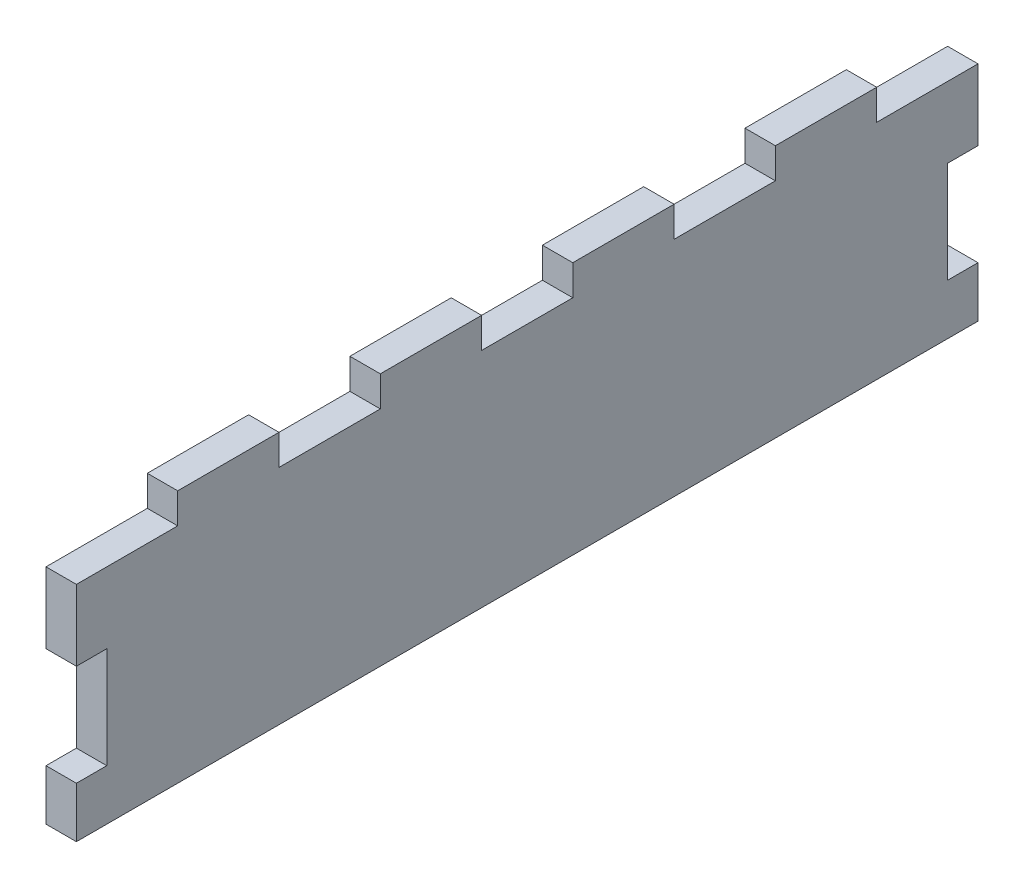
ISO-10303-21;
HEADER;
FILE_DESCRIPTION(('STEP AP214'),'2;1');
FILE_NAME('part.step','',(''),(''),'','','');
FILE_SCHEMA(('AUTOMOTIVE_DESIGN { 1 0 10303 214 1 1 1 1 }'));
ENDSEC;
DATA;
#1=APPLICATION_CONTEXT('core data for automotive mechanical design processes');
#2=APPLICATION_PROTOCOL_DEFINITION('international standard','automotive_design',2000,#1);
#3=PRODUCT_CONTEXT('',#1,'mechanical');
#4=PRODUCT('Part','Part','',(#3));
#5=PRODUCT_RELATED_PRODUCT_CATEGORY('part','',(#4));
#6=PRODUCT_DEFINITION_FORMATION('','',#4);
#7=PRODUCT_DEFINITION_CONTEXT('part definition',#1,'design');
#8=PRODUCT_DEFINITION('design','',#6,#7);
#9=PRODUCT_DEFINITION_SHAPE('','',#8);
#10=(LENGTH_UNIT() NAMED_UNIT(*) SI_UNIT(.MILLI.,.METRE.));
#11=(NAMED_UNIT(*) PLANE_ANGLE_UNIT() SI_UNIT($,.RADIAN.));
#12=(NAMED_UNIT(*) SI_UNIT($,.STERADIAN.) SOLID_ANGLE_UNIT());
#13=UNCERTAINTY_MEASURE_WITH_UNIT(LENGTH_MEASURE(1.E-05),#10,'distance_accuracy_value','');
#14=(GEOMETRIC_REPRESENTATION_CONTEXT(3) GLOBAL_UNCERTAINTY_ASSIGNED_CONTEXT((#13)) GLOBAL_UNIT_ASSIGNED_CONTEXT((#10,
#11,#12)) REPRESENTATION_CONTEXT('',''));
#15=CARTESIAN_POINT('',(0.,0.,0.));
#16=DIRECTION('',(0.,0.,1.));
#17=DIRECTION('',(1.,0.,0.));
#18=AXIS2_PLACEMENT_3D('',#15,#16,#17);
#19=CARTESIAN_POINT('',(3.,0.,0.));
#20=DIRECTION('',(0.,0.,-1.));
#21=DIRECTION('',(-1.,0.,0.));
#22=AXIS2_PLACEMENT_3D('',#19,#20,#21);
#23=PLANE('',#22);
#24=DIRECTION('',(0.,-1.,0.));
#25=VECTOR('',#24,1.);
#26=CARTESIAN_POINT('',(0.,0.,0.));
#27=LINE('',#26,#25);
#28=CARTESIAN_POINT('',(0.,5.,0.));
#29=VERTEX_POINT('',#28);
#30=CARTESIAN_POINT('',(0.,0.,0.));
#31=VERTEX_POINT('',#30);
#32=EDGE_CURVE('E248',#29,#31,#27,.T.);
#33=ORIENTED_EDGE('',*,*,#32,.T.);
#34=DIRECTION('',(-1.,0.,0.));
#35=VECTOR('',#34,1.);
#36=CARTESIAN_POINT('',(3.,0.,0.));
#37=LINE('',#36,#35);
#38=CARTESIAN_POINT('',(3.,0.,0.));
#39=VERTEX_POINT('',#38);
#40=EDGE_CURVE('E11',#39,#31,#37,.T.);
#41=ORIENTED_EDGE('',*,*,#40,.F.);
#42=DIRECTION('',(0.,-1.,0.));
#43=VECTOR('',#42,1.);
#44=CARTESIAN_POINT('',(3.,0.,0.));
#45=LINE('',#44,#43);
#46=CARTESIAN_POINT('',(3.,5.,0.));
#47=VERTEX_POINT('',#46);
#48=EDGE_CURVE('E302',#47,#39,#45,.T.);
#49=ORIENTED_EDGE('',*,*,#48,.F.);
#50=DIRECTION('',(-1.,0.,0.));
#51=VECTOR('',#50,1.);
#52=CARTESIAN_POINT('',(3.,5.,0.));
#53=LINE('',#52,#51);
#54=EDGE_CURVE('E244',#47,#29,#53,.T.);
#55=ORIENTED_EDGE('',*,*,#54,.T.);
#56=EDGE_LOOP('',(#33,#41,#49,#55));
#57=FACE_BOUND('',#56,.T.);
#58=ADVANCED_FACE('F32',(#57),#23,.F.);
#59=CARTESIAN_POINT('',(3.,0.,0.));
#60=DIRECTION('',(0.,1.,0.));
#61=DIRECTION('',(0.,0.,1.));
#62=AXIS2_PLACEMENT_3D('',#59,#60,#61);
#63=PLANE('',#62);
#64=DIRECTION('',(0.,0.,-1.));
#65=VECTOR('',#64,1.);
#66=CARTESIAN_POINT('',(0.,0.,0.));
#67=LINE('',#66,#65);
#68=CARTESIAN_POINT('',(0.,0.,-89.));
#69=VERTEX_POINT('',#68);
#70=EDGE_CURVE('E251',#31,#69,#67,.T.);
#71=ORIENTED_EDGE('',*,*,#70,.T.);
#72=DIRECTION('',(-1.,0.,0.));
#73=VECTOR('',#72,1.);
#74=CARTESIAN_POINT('',(3.,0.,-89.));
#75=LINE('',#74,#73);
#76=CARTESIAN_POINT('',(3.,0.,-89.));
#77=VERTEX_POINT('',#76);
#78=EDGE_CURVE('E40',#77,#69,#75,.T.);
#79=ORIENTED_EDGE('',*,*,#78,.F.);
#80=DIRECTION('',(0.,0.,-1.));
#81=VECTOR('',#80,1.);
#82=CARTESIAN_POINT('',(3.,0.,0.));
#83=LINE('',#82,#81);
#84=EDGE_CURVE('E151',#39,#77,#83,.T.);
#85=ORIENTED_EDGE('',*,*,#84,.F.);
#86=ORIENTED_EDGE('',*,*,#40,.T.);
#87=EDGE_LOOP('',(#71,#79,#85,#86));
#88=FACE_BOUND('',#87,.T.);
#89=ADVANCED_FACE('F460',(#88),#63,.F.);
#90=CARTESIAN_POINT('',(3.,0.,-89.));
#91=DIRECTION('',(0.,0.,1.));
#92=DIRECTION('',(1.,0.,0.));
#93=AXIS2_PLACEMENT_3D('',#90,#91,#92);
#94=PLANE('',#93);
#95=DIRECTION('',(0.,1.,0.));
#96=VECTOR('',#95,1.);
#97=CARTESIAN_POINT('',(0.,0.,-89.));
#98=LINE('',#97,#96);
#99=CARTESIAN_POINT('',(0.,5.,-89.));
#100=VERTEX_POINT('',#99);
#101=EDGE_CURVE('E253',#69,#100,#98,.T.);
#102=ORIENTED_EDGE('',*,*,#101,.T.);
#103=DIRECTION('',(-1.,0.,0.));
#104=VECTOR('',#103,1.);
#105=CARTESIAN_POINT('',(3.,5.,-89.));
#106=LINE('',#105,#104);
#107=CARTESIAN_POINT('',(3.,5.,-89.));
#108=VERTEX_POINT('',#107);
#109=EDGE_CURVE('E369',#108,#100,#106,.T.);
#110=ORIENTED_EDGE('',*,*,#109,.F.);
#111=DIRECTION('',(0.,1.,0.));
#112=VECTOR('',#111,1.);
#113=CARTESIAN_POINT('',(3.,0.,-89.));
#114=LINE('',#113,#112);
#115=EDGE_CURVE('E377',#77,#108,#114,.T.);
#116=ORIENTED_EDGE('',*,*,#115,.F.);
#117=ORIENTED_EDGE('',*,*,#78,.T.);
#118=EDGE_LOOP('',(#102,#110,#116,#117));
#119=FACE_BOUND('',#118,.T.);
#120=ADVANCED_FACE('F375',(#119),#94,.F.);
#121=CARTESIAN_POINT('',(3.,5.,-89.));
#122=DIRECTION('',(0.,-1.,0.));
#123=DIRECTION('',(0.,0.,-1.));
#124=AXIS2_PLACEMENT_3D('',#121,#122,#123);
#125=PLANE('',#124);
#126=DIRECTION('',(0.,0.,1.));
#127=VECTOR('',#126,1.);
#128=CARTESIAN_POINT('',(0.,5.,-89.));
#129=LINE('',#128,#127);
#130=CARTESIAN_POINT('',(0.,5.,-86.));
#131=VERTEX_POINT('',#130);
#132=EDGE_CURVE('E255',#100,#131,#129,.T.);
#133=ORIENTED_EDGE('',*,*,#132,.T.);
#134=DIRECTION('',(-1.,0.,0.));
#135=VECTOR('',#134,1.);
#136=CARTESIAN_POINT('',(3.,5.,-86.));
#137=LINE('',#136,#135);
#138=CARTESIAN_POINT('',(3.,5.,-86.));
#139=VERTEX_POINT('',#138);
#140=EDGE_CURVE('E366',#139,#131,#137,.T.);
#141=ORIENTED_EDGE('',*,*,#140,.F.);
#142=DIRECTION('',(0.,0.,1.));
#143=VECTOR('',#142,1.);
#144=CARTESIAN_POINT('',(3.,5.,-89.));
#145=LINE('',#144,#143);
#146=EDGE_CURVE('E395',#108,#139,#145,.T.);
#147=ORIENTED_EDGE('',*,*,#146,.F.);
#148=ORIENTED_EDGE('',*,*,#109,.T.);
#149=EDGE_LOOP('',(#133,#141,#147,#148));
#150=FACE_BOUND('',#149,.T.);
#151=ADVANCED_FACE('F386',(#150),#125,.F.);
#152=CARTESIAN_POINT('',(3.,15.,-86.));
#153=DIRECTION('',(0.,0.,1.));
#154=DIRECTION('',(1.,0.,0.));
#155=AXIS2_PLACEMENT_3D('',#152,#153,#154);
#156=PLANE('',#155);
#157=DIRECTION('',(0.,1.,0.));
#158=VECTOR('',#157,1.);
#159=CARTESIAN_POINT('',(0.,15.,-86.));
#160=LINE('',#159,#158);
#161=CARTESIAN_POINT('',(0.,15.,-86.));
#162=VERTEX_POINT('',#161);
#163=EDGE_CURVE('E257',#131,#162,#160,.T.);
#164=ORIENTED_EDGE('',*,*,#163,.T.);
#165=DIRECTION('',(-1.,0.,0.));
#166=VECTOR('',#165,1.);
#167=CARTESIAN_POINT('',(3.,15.,-86.));
#168=LINE('',#167,#166);
#169=CARTESIAN_POINT('',(3.,15.,-86.));
#170=VERTEX_POINT('',#169);
#171=EDGE_CURVE('E363',#170,#162,#168,.T.);
#172=ORIENTED_EDGE('',*,*,#171,.F.);
#173=DIRECTION('',(0.,1.,0.));
#174=VECTOR('',#173,1.);
#175=CARTESIAN_POINT('',(3.,15.,-86.));
#176=LINE('',#175,#174);
#177=EDGE_CURVE('E392',#139,#170,#176,.T.);
#178=ORIENTED_EDGE('',*,*,#177,.F.);
#179=ORIENTED_EDGE('',*,*,#140,.T.);
#180=EDGE_LOOP('',(#164,#172,#178,#179));
#181=FACE_BOUND('',#180,.T.);
#182=ADVANCED_FACE('F390',(#181),#156,.F.);
#183=CARTESIAN_POINT('',(3.,15.,-89.));
#184=DIRECTION('',(0.,1.,0.));
#185=DIRECTION('',(0.,0.,1.));
#186=AXIS2_PLACEMENT_3D('',#183,#184,#185);
#187=PLANE('',#186);
#188=DIRECTION('',(0.,0.,-1.));
#189=VECTOR('',#188,1.);
#190=CARTESIAN_POINT('',(0.,15.,-89.));
#191=LINE('',#190,#189);
#192=CARTESIAN_POINT('',(0.,15.,-89.));
#193=VERTEX_POINT('',#192);
#194=EDGE_CURVE('E259',#162,#193,#191,.T.);
#195=ORIENTED_EDGE('',*,*,#194,.T.);
#196=DIRECTION('',(-1.,0.,0.));
#197=VECTOR('',#196,1.);
#198=CARTESIAN_POINT('',(3.,15.,-89.));
#199=LINE('',#198,#197);
#200=CARTESIAN_POINT('',(3.,15.,-89.));
#201=VERTEX_POINT('',#200);
#202=EDGE_CURVE('E360',#201,#193,#199,.T.);
#203=ORIENTED_EDGE('',*,*,#202,.F.);
#204=DIRECTION('',(0.,0.,-1.));
#205=VECTOR('',#204,1.);
#206=CARTESIAN_POINT('',(3.,15.,-89.));
#207=LINE('',#206,#205);
#208=EDGE_CURVE('E394',#170,#201,#207,.T.);
#209=ORIENTED_EDGE('',*,*,#208,.F.);
#210=ORIENTED_EDGE('',*,*,#171,.T.);
#211=EDGE_LOOP('',(#195,#203,#209,#210));
#212=FACE_BOUND('',#211,.T.);
#213=ADVANCED_FACE('F473',(#212),#187,.F.);
#214=CARTESIAN_POINT('',(3.,15.,-89.));
#215=DIRECTION('',(0.,0.,1.));
#216=DIRECTION('',(1.,0.,0.));
#217=AXIS2_PLACEMENT_3D('',#214,#215,#216);
#218=PLANE('',#217);
#219=DIRECTION('',(0.,1.,0.));
#220=VECTOR('',#219,1.);
#221=CARTESIAN_POINT('',(0.,15.,-89.));
#222=LINE('',#221,#220);
#223=CARTESIAN_POINT('',(0.,22.,-89.));
#224=VERTEX_POINT('',#223);
#225=EDGE_CURVE('E261',#193,#224,#222,.T.);
#226=ORIENTED_EDGE('',*,*,#225,.T.);
#227=DIRECTION('',(-1.,0.,0.));
#228=VECTOR('',#227,1.);
#229=CARTESIAN_POINT('',(3.,22.,-89.));
#230=LINE('',#229,#228);
#231=CARTESIAN_POINT('',(3.,22.,-89.));
#232=VERTEX_POINT('',#231);
#233=EDGE_CURVE('E357',#232,#224,#230,.T.);
#234=ORIENTED_EDGE('',*,*,#233,.F.);
#235=DIRECTION('',(0.,1.,0.));
#236=VECTOR('',#235,1.);
#237=CARTESIAN_POINT('',(3.,15.,-89.));
#238=LINE('',#237,#236);
#239=EDGE_CURVE('E397',#201,#232,#238,.T.);
#240=ORIENTED_EDGE('',*,*,#239,.F.);
#241=ORIENTED_EDGE('',*,*,#202,.T.);
#242=EDGE_LOOP('',(#226,#234,#240,#241));
#243=FACE_BOUND('',#242,.T.);
#244=ADVANCED_FACE('F476',(#243),#218,.F.);
#245=CARTESIAN_POINT('',(3.,22.,-79.));
#246=DIRECTION('',(0.,-1.,0.));
#247=DIRECTION('',(0.,0.,-1.));
#248=AXIS2_PLACEMENT_3D('',#245,#246,#247);
#249=PLANE('',#248);
#250=DIRECTION('',(0.,0.,1.));
#251=VECTOR('',#250,1.);
#252=CARTESIAN_POINT('',(0.,22.,-79.));
#253=LINE('',#252,#251);
#254=CARTESIAN_POINT('',(0.,22.,-79.));
#255=VERTEX_POINT('',#254);
#256=EDGE_CURVE('E263',#224,#255,#253,.T.);
#257=ORIENTED_EDGE('',*,*,#256,.T.);
#258=DIRECTION('',(-1.,0.,0.));
#259=VECTOR('',#258,1.);
#260=CARTESIAN_POINT('',(3.,22.,-79.));
#261=LINE('',#260,#259);
#262=CARTESIAN_POINT('',(3.,22.,-79.));
#263=VERTEX_POINT('',#262);
#264=EDGE_CURVE('E354',#263,#255,#261,.T.);
#265=ORIENTED_EDGE('',*,*,#264,.F.);
#266=DIRECTION('',(0.,0.,1.));
#267=VECTOR('',#266,1.);
#268=CARTESIAN_POINT('',(3.,22.,-79.));
#269=LINE('',#268,#267);
#270=EDGE_CURVE('E403',#232,#263,#269,.T.);
#271=ORIENTED_EDGE('',*,*,#270,.F.);
#272=ORIENTED_EDGE('',*,*,#233,.T.);
#273=EDGE_LOOP('',(#257,#265,#271,#272));
#274=FACE_BOUND('',#273,.T.);
#275=ADVANCED_FACE('F480',(#274),#249,.F.);
#276=CARTESIAN_POINT('',(3.,22.,-79.));
#277=DIRECTION('',(0.,0.,1.));
#278=DIRECTION('',(1.,0.,0.));
#279=AXIS2_PLACEMENT_3D('',#276,#277,#278);
#280=PLANE('',#279);
#281=DIRECTION('',(0.,1.,0.));
#282=VECTOR('',#281,1.);
#283=CARTESIAN_POINT('',(0.,22.,-79.));
#284=LINE('',#283,#282);
#285=CARTESIAN_POINT('',(0.,25.,-79.));
#286=VERTEX_POINT('',#285);
#287=EDGE_CURVE('E265',#255,#286,#284,.T.);
#288=ORIENTED_EDGE('',*,*,#287,.T.);
#289=DIRECTION('',(-1.,0.,0.));
#290=VECTOR('',#289,1.);
#291=CARTESIAN_POINT('',(3.,25.,-79.));
#292=LINE('',#291,#290);
#293=CARTESIAN_POINT('',(3.,25.,-79.));
#294=VERTEX_POINT('',#293);
#295=EDGE_CURVE('E351',#294,#286,#292,.T.);
#296=ORIENTED_EDGE('',*,*,#295,.F.);
#297=DIRECTION('',(0.,1.,0.));
#298=VECTOR('',#297,1.);
#299=CARTESIAN_POINT('',(3.,22.,-79.));
#300=LINE('',#299,#298);
#301=EDGE_CURVE('E405',#263,#294,#300,.T.);
#302=ORIENTED_EDGE('',*,*,#301,.F.);
#303=ORIENTED_EDGE('',*,*,#264,.T.);
#304=EDGE_LOOP('',(#288,#296,#302,#303));
#305=FACE_BOUND('',#304,.T.);
#306=ADVANCED_FACE('F484',(#305),#280,.F.);
#307=CARTESIAN_POINT('',(3.,25.,-69.));
#308=DIRECTION('',(0.,-1.,0.));
#309=DIRECTION('',(0.,0.,-1.));
#310=AXIS2_PLACEMENT_3D('',#307,#308,#309);
#311=PLANE('',#310);
#312=DIRECTION('',(0.,0.,1.));
#313=VECTOR('',#312,1.);
#314=CARTESIAN_POINT('',(0.,25.,-69.));
#315=LINE('',#314,#313);
#316=CARTESIAN_POINT('',(0.,25.,-69.));
#317=VERTEX_POINT('',#316);
#318=EDGE_CURVE('E267',#286,#317,#315,.T.);
#319=ORIENTED_EDGE('',*,*,#318,.T.);
#320=DIRECTION('',(-1.,0.,0.));
#321=VECTOR('',#320,1.);
#322=CARTESIAN_POINT('',(3.,25.,-69.));
#323=LINE('',#322,#321);
#324=CARTESIAN_POINT('',(3.,25.,-69.));
#325=VERTEX_POINT('',#324);
#326=EDGE_CURVE('E348',#325,#317,#323,.T.);
#327=ORIENTED_EDGE('',*,*,#326,.F.);
#328=DIRECTION('',(0.,0.,1.));
#329=VECTOR('',#328,1.);
#330=CARTESIAN_POINT('',(3.,25.,-69.));
#331=LINE('',#330,#329);
#332=EDGE_CURVE('E407',#294,#325,#331,.T.);
#333=ORIENTED_EDGE('',*,*,#332,.F.);
#334=ORIENTED_EDGE('',*,*,#295,.T.);
#335=EDGE_LOOP('',(#319,#327,#333,#334));
#336=FACE_BOUND('',#335,.T.);
#337=ADVANCED_FACE('F488',(#336),#311,.F.);
#338=CARTESIAN_POINT('',(3.,22.,-69.));
#339=DIRECTION('',(0.,0.,-1.));
#340=DIRECTION('',(-1.,0.,0.));
#341=AXIS2_PLACEMENT_3D('',#338,#339,#340);
#342=PLANE('',#341);
#343=DIRECTION('',(0.,-1.,0.));
#344=VECTOR('',#343,1.);
#345=CARTESIAN_POINT('',(0.,22.,-69.));
#346=LINE('',#345,#344);
#347=CARTESIAN_POINT('',(0.,22.,-69.));
#348=VERTEX_POINT('',#347);
#349=EDGE_CURVE('E269',#317,#348,#346,.T.);
#350=ORIENTED_EDGE('',*,*,#349,.T.);
#351=DIRECTION('',(-1.,0.,0.));
#352=VECTOR('',#351,1.);
#353=CARTESIAN_POINT('',(3.,22.,-69.));
#354=LINE('',#353,#352);
#355=CARTESIAN_POINT('',(3.,22.,-69.));
#356=VERTEX_POINT('',#355);
#357=EDGE_CURVE('E345',#356,#348,#354,.T.);
#358=ORIENTED_EDGE('',*,*,#357,.F.);
#359=DIRECTION('',(0.,-1.,0.));
#360=VECTOR('',#359,1.);
#361=CARTESIAN_POINT('',(3.,22.,-69.));
#362=LINE('',#361,#360);
#363=EDGE_CURVE('E409',#325,#356,#362,.T.);
#364=ORIENTED_EDGE('',*,*,#363,.F.);
#365=ORIENTED_EDGE('',*,*,#326,.T.);
#366=EDGE_LOOP('',(#350,#358,#364,#365));
#367=FACE_BOUND('',#366,.T.);
#368=ADVANCED_FACE('F492',(#367),#342,.F.);
#369=CARTESIAN_POINT('',(3.,22.,-59.));
#370=DIRECTION('',(0.,-1.,0.));
#371=DIRECTION('',(0.,0.,-1.));
#372=AXIS2_PLACEMENT_3D('',#369,#370,#371);
#373=PLANE('',#372);
#374=DIRECTION('',(0.,0.,1.));
#375=VECTOR('',#374,1.);
#376=CARTESIAN_POINT('',(0.,22.,-59.));
#377=LINE('',#376,#375);
#378=CARTESIAN_POINT('',(0.,22.,-59.));
#379=VERTEX_POINT('',#378);
#380=EDGE_CURVE('E271',#348,#379,#377,.T.);
#381=ORIENTED_EDGE('',*,*,#380,.T.);
#382=DIRECTION('',(-1.,0.,0.));
#383=VECTOR('',#382,1.);
#384=CARTESIAN_POINT('',(3.,22.,-59.));
#385=LINE('',#384,#383);
#386=CARTESIAN_POINT('',(3.,22.,-59.));
#387=VERTEX_POINT('',#386);
#388=EDGE_CURVE('E342',#387,#379,#385,.T.);
#389=ORIENTED_EDGE('',*,*,#388,.F.);
#390=DIRECTION('',(0.,0.,1.));
#391=VECTOR('',#390,1.);
#392=CARTESIAN_POINT('',(3.,22.,-59.));
#393=LINE('',#392,#391);
#394=EDGE_CURVE('E411',#356,#387,#393,.T.);
#395=ORIENTED_EDGE('',*,*,#394,.F.);
#396=ORIENTED_EDGE('',*,*,#357,.T.);
#397=EDGE_LOOP('',(#381,#389,#395,#396));
#398=FACE_BOUND('',#397,.T.);
#399=ADVANCED_FACE('F496',(#398),#373,.F.);
#400=CARTESIAN_POINT('',(3.,22.,-59.));
#401=DIRECTION('',(0.,0.,1.));
#402=DIRECTION('',(1.,0.,0.));
#403=AXIS2_PLACEMENT_3D('',#400,#401,#402);
#404=PLANE('',#403);
#405=DIRECTION('',(0.,1.,0.));
#406=VECTOR('',#405,1.);
#407=CARTESIAN_POINT('',(0.,22.,-59.));
#408=LINE('',#407,#406);
#409=CARTESIAN_POINT('',(0.,25.,-59.));
#410=VERTEX_POINT('',#409);
#411=EDGE_CURVE('E273',#379,#410,#408,.T.);
#412=ORIENTED_EDGE('',*,*,#411,.T.);
#413=DIRECTION('',(-1.,0.,0.));
#414=VECTOR('',#413,1.);
#415=CARTESIAN_POINT('',(3.,25.,-59.));
#416=LINE('',#415,#414);
#417=CARTESIAN_POINT('',(3.,25.,-59.));
#418=VERTEX_POINT('',#417);
#419=EDGE_CURVE('E339',#418,#410,#416,.T.);
#420=ORIENTED_EDGE('',*,*,#419,.F.);
#421=DIRECTION('',(0.,1.,0.));
#422=VECTOR('',#421,1.);
#423=CARTESIAN_POINT('',(3.,22.,-59.));
#424=LINE('',#423,#422);
#425=EDGE_CURVE('E413',#387,#418,#424,.T.);
#426=ORIENTED_EDGE('',*,*,#425,.F.);
#427=ORIENTED_EDGE('',*,*,#388,.T.);
#428=EDGE_LOOP('',(#412,#420,#426,#427));
#429=FACE_BOUND('',#428,.T.);
#430=ADVANCED_FACE('F500',(#429),#404,.F.);
#431=CARTESIAN_POINT('',(3.,25.,-49.));
#432=DIRECTION('',(0.,-1.,0.));
#433=DIRECTION('',(0.,0.,-1.));
#434=AXIS2_PLACEMENT_3D('',#431,#432,#433);
#435=PLANE('',#434);
#436=DIRECTION('',(0.,0.,1.));
#437=VECTOR('',#436,1.);
#438=CARTESIAN_POINT('',(0.,25.,-49.));
#439=LINE('',#438,#437);
#440=CARTESIAN_POINT('',(0.,25.,-49.));
#441=VERTEX_POINT('',#440);
#442=EDGE_CURVE('E275',#410,#441,#439,.T.);
#443=ORIENTED_EDGE('',*,*,#442,.T.);
#444=DIRECTION('',(-1.,0.,0.));
#445=VECTOR('',#444,1.);
#446=CARTESIAN_POINT('',(3.,25.,-49.));
#447=LINE('',#446,#445);
#448=CARTESIAN_POINT('',(3.,25.,-49.));
#449=VERTEX_POINT('',#448);
#450=EDGE_CURVE('E336',#449,#441,#447,.T.);
#451=ORIENTED_EDGE('',*,*,#450,.F.);
#452=DIRECTION('',(0.,0.,1.));
#453=VECTOR('',#452,1.);
#454=CARTESIAN_POINT('',(3.,25.,-49.));
#455=LINE('',#454,#453);
#456=EDGE_CURVE('E415',#418,#449,#455,.T.);
#457=ORIENTED_EDGE('',*,*,#456,.F.);
#458=ORIENTED_EDGE('',*,*,#419,.T.);
#459=EDGE_LOOP('',(#443,#451,#457,#458));
#460=FACE_BOUND('',#459,.T.);
#461=ADVANCED_FACE('F504',(#460),#435,.F.);
#462=CARTESIAN_POINT('',(3.,22.,-49.));
#463=DIRECTION('',(0.,0.,-1.));
#464=DIRECTION('',(-1.,0.,0.));
#465=AXIS2_PLACEMENT_3D('',#462,#463,#464);
#466=PLANE('',#465);
#467=DIRECTION('',(0.,-1.,0.));
#468=VECTOR('',#467,1.);
#469=CARTESIAN_POINT('',(0.,22.,-49.));
#470=LINE('',#469,#468);
#471=CARTESIAN_POINT('',(0.,22.,-49.));
#472=VERTEX_POINT('',#471);
#473=EDGE_CURVE('E277',#441,#472,#470,.T.);
#474=ORIENTED_EDGE('',*,*,#473,.T.);
#475=DIRECTION('',(-1.,0.,0.));
#476=VECTOR('',#475,1.);
#477=CARTESIAN_POINT('',(3.,22.,-49.));
#478=LINE('',#477,#476);
#479=CARTESIAN_POINT('',(3.,22.,-49.));
#480=VERTEX_POINT('',#479);
#481=EDGE_CURVE('E333',#480,#472,#478,.T.);
#482=ORIENTED_EDGE('',*,*,#481,.F.);
#483=DIRECTION('',(0.,-1.,0.));
#484=VECTOR('',#483,1.);
#485=CARTESIAN_POINT('',(3.,22.,-49.));
#486=LINE('',#485,#484);
#487=EDGE_CURVE('E417',#449,#480,#486,.T.);
#488=ORIENTED_EDGE('',*,*,#487,.F.);
#489=ORIENTED_EDGE('',*,*,#450,.T.);
#490=EDGE_LOOP('',(#474,#482,#488,#489));
#491=FACE_BOUND('',#490,.T.);
#492=ADVANCED_FACE('F508',(#491),#466,.F.);
#493=CARTESIAN_POINT('',(3.,22.,-40.));
#494=DIRECTION('',(0.,-1.,0.));
#495=DIRECTION('',(0.,0.,-1.));
#496=AXIS2_PLACEMENT_3D('',#493,#494,#495);
#497=PLANE('',#496);
#498=DIRECTION('',(0.,0.,1.));
#499=VECTOR('',#498,1.);
#500=CARTESIAN_POINT('',(0.,22.,-40.));
#501=LINE('',#500,#499);
#502=CARTESIAN_POINT('',(0.,22.,-40.));
#503=VERTEX_POINT('',#502);
#504=EDGE_CURVE('E279',#472,#503,#501,.T.);
#505=ORIENTED_EDGE('',*,*,#504,.T.);
#506=DIRECTION('',(-1.,0.,0.));
#507=VECTOR('',#506,1.);
#508=CARTESIAN_POINT('',(3.,22.,-40.));
#509=LINE('',#508,#507);
#510=CARTESIAN_POINT('',(3.,22.,-40.));
#511=VERTEX_POINT('',#510);
#512=EDGE_CURVE('E330',#511,#503,#509,.T.);
#513=ORIENTED_EDGE('',*,*,#512,.F.);
#514=DIRECTION('',(0.,0.,1.));
#515=VECTOR('',#514,1.);
#516=CARTESIAN_POINT('',(3.,22.,-40.));
#517=LINE('',#516,#515);
#518=EDGE_CURVE('E419',#480,#511,#517,.T.);
#519=ORIENTED_EDGE('',*,*,#518,.F.);
#520=ORIENTED_EDGE('',*,*,#481,.T.);
#521=EDGE_LOOP('',(#505,#513,#519,#520));
#522=FACE_BOUND('',#521,.T.);
#523=ADVANCED_FACE('F512',(#522),#497,.F.);
#524=CARTESIAN_POINT('',(3.,22.,-40.));
#525=DIRECTION('',(0.,0.,1.));
#526=DIRECTION('',(1.,0.,0.));
#527=AXIS2_PLACEMENT_3D('',#524,#525,#526);
#528=PLANE('',#527);
#529=DIRECTION('',(0.,1.,0.));
#530=VECTOR('',#529,1.);
#531=CARTESIAN_POINT('',(0.,22.,-40.));
#532=LINE('',#531,#530);
#533=CARTESIAN_POINT('',(0.,25.,-40.));
#534=VERTEX_POINT('',#533);
#535=EDGE_CURVE('E281',#503,#534,#532,.T.);
#536=ORIENTED_EDGE('',*,*,#535,.T.);
#537=DIRECTION('',(-1.,0.,0.));
#538=VECTOR('',#537,1.);
#539=CARTESIAN_POINT('',(3.,25.,-40.));
#540=LINE('',#539,#538);
#541=CARTESIAN_POINT('',(3.,25.,-40.));
#542=VERTEX_POINT('',#541);
#543=EDGE_CURVE('E327',#542,#534,#540,.T.);
#544=ORIENTED_EDGE('',*,*,#543,.F.);
#545=DIRECTION('',(0.,1.,0.));
#546=VECTOR('',#545,1.);
#547=CARTESIAN_POINT('',(3.,22.,-40.));
#548=LINE('',#547,#546);
#549=EDGE_CURVE('E421',#511,#542,#548,.T.);
#550=ORIENTED_EDGE('',*,*,#549,.F.);
#551=ORIENTED_EDGE('',*,*,#512,.T.);
#552=EDGE_LOOP('',(#536,#544,#550,#551));
#553=FACE_BOUND('',#552,.T.);
#554=ADVANCED_FACE('F516',(#553),#528,.F.);
#555=CARTESIAN_POINT('',(3.,25.,-30.));
#556=DIRECTION('',(0.,-1.,0.));
#557=DIRECTION('',(0.,0.,-1.));
#558=AXIS2_PLACEMENT_3D('',#555,#556,#557);
#559=PLANE('',#558);
#560=DIRECTION('',(0.,0.,1.));
#561=VECTOR('',#560,1.);
#562=CARTESIAN_POINT('',(0.,25.,-30.));
#563=LINE('',#562,#561);
#564=CARTESIAN_POINT('',(0.,25.,-30.));
#565=VERTEX_POINT('',#564);
#566=EDGE_CURVE('E283',#534,#565,#563,.T.);
#567=ORIENTED_EDGE('',*,*,#566,.T.);
#568=DIRECTION('',(-1.,0.,0.));
#569=VECTOR('',#568,1.);
#570=CARTESIAN_POINT('',(3.,25.,-30.));
#571=LINE('',#570,#569);
#572=CARTESIAN_POINT('',(3.,25.,-30.));
#573=VERTEX_POINT('',#572);
#574=EDGE_CURVE('E324',#573,#565,#571,.T.);
#575=ORIENTED_EDGE('',*,*,#574,.F.);
#576=DIRECTION('',(0.,0.,1.));
#577=VECTOR('',#576,1.);
#578=CARTESIAN_POINT('',(3.,25.,-30.));
#579=LINE('',#578,#577);
#580=EDGE_CURVE('E423',#542,#573,#579,.T.);
#581=ORIENTED_EDGE('',*,*,#580,.F.);
#582=ORIENTED_EDGE('',*,*,#543,.T.);
#583=EDGE_LOOP('',(#567,#575,#581,#582));
#584=FACE_BOUND('',#583,.T.);
#585=ADVANCED_FACE('F520',(#584),#559,.F.);
#586=CARTESIAN_POINT('',(3.,22.,-30.));
#587=DIRECTION('',(0.,0.,-1.));
#588=DIRECTION('',(-1.,0.,0.));
#589=AXIS2_PLACEMENT_3D('',#586,#587,#588);
#590=PLANE('',#589);
#591=DIRECTION('',(0.,-1.,0.));
#592=VECTOR('',#591,1.);
#593=CARTESIAN_POINT('',(0.,22.,-30.));
#594=LINE('',#593,#592);
#595=CARTESIAN_POINT('',(0.,22.,-30.));
#596=VERTEX_POINT('',#595);
#597=EDGE_CURVE('E285',#565,#596,#594,.T.);
#598=ORIENTED_EDGE('',*,*,#597,.T.);
#599=DIRECTION('',(-1.,0.,0.));
#600=VECTOR('',#599,1.);
#601=CARTESIAN_POINT('',(3.,22.,-30.));
#602=LINE('',#601,#600);
#603=CARTESIAN_POINT('',(3.,22.,-30.));
#604=VERTEX_POINT('',#603);
#605=EDGE_CURVE('E321',#604,#596,#602,.T.);
#606=ORIENTED_EDGE('',*,*,#605,.F.);
#607=DIRECTION('',(0.,-1.,0.));
#608=VECTOR('',#607,1.);
#609=CARTESIAN_POINT('',(3.,22.,-30.));
#610=LINE('',#609,#608);
#611=EDGE_CURVE('E425',#573,#604,#610,.T.);
#612=ORIENTED_EDGE('',*,*,#611,.F.);
#613=ORIENTED_EDGE('',*,*,#574,.T.);
#614=EDGE_LOOP('',(#598,#606,#612,#613));
#615=FACE_BOUND('',#614,.T.);
#616=ADVANCED_FACE('F524',(#615),#590,.F.);
#617=CARTESIAN_POINT('',(3.,22.,-20.));
#618=DIRECTION('',(0.,-1.,0.));
#619=DIRECTION('',(0.,0.,-1.));
#620=AXIS2_PLACEMENT_3D('',#617,#618,#619);
#621=PLANE('',#620);
#622=DIRECTION('',(0.,0.,1.));
#623=VECTOR('',#622,1.);
#624=CARTESIAN_POINT('',(0.,22.,-20.));
#625=LINE('',#624,#623);
#626=CARTESIAN_POINT('',(0.,22.,-20.));
#627=VERTEX_POINT('',#626);
#628=EDGE_CURVE('E287',#596,#627,#625,.T.);
#629=ORIENTED_EDGE('',*,*,#628,.T.);
#630=DIRECTION('',(-1.,0.,0.));
#631=VECTOR('',#630,1.);
#632=CARTESIAN_POINT('',(3.,22.,-20.));
#633=LINE('',#632,#631);
#634=CARTESIAN_POINT('',(3.,22.,-20.));
#635=VERTEX_POINT('',#634);
#636=EDGE_CURVE('E318',#635,#627,#633,.T.);
#637=ORIENTED_EDGE('',*,*,#636,.F.);
#638=DIRECTION('',(0.,0.,1.));
#639=VECTOR('',#638,1.);
#640=CARTESIAN_POINT('',(3.,22.,-20.));
#641=LINE('',#640,#639);
#642=EDGE_CURVE('E427',#604,#635,#641,.T.);
#643=ORIENTED_EDGE('',*,*,#642,.F.);
#644=ORIENTED_EDGE('',*,*,#605,.T.);
#645=EDGE_LOOP('',(#629,#637,#643,#644));
#646=FACE_BOUND('',#645,.T.);
#647=ADVANCED_FACE('F528',(#646),#621,.F.);
#648=CARTESIAN_POINT('',(3.,22.,-20.));
#649=DIRECTION('',(0.,0.,1.));
#650=DIRECTION('',(1.,0.,0.));
#651=AXIS2_PLACEMENT_3D('',#648,#649,#650);
#652=PLANE('',#651);
#653=DIRECTION('',(0.,1.,0.));
#654=VECTOR('',#653,1.);
#655=CARTESIAN_POINT('',(0.,22.,-20.));
#656=LINE('',#655,#654);
#657=CARTESIAN_POINT('',(0.,25.,-20.));
#658=VERTEX_POINT('',#657);
#659=EDGE_CURVE('E289',#627,#658,#656,.T.);
#660=ORIENTED_EDGE('',*,*,#659,.T.);
#661=DIRECTION('',(-1.,0.,0.));
#662=VECTOR('',#661,1.);
#663=CARTESIAN_POINT('',(3.,25.,-20.));
#664=LINE('',#663,#662);
#665=CARTESIAN_POINT('',(3.,25.,-20.));
#666=VERTEX_POINT('',#665);
#667=EDGE_CURVE('E315',#666,#658,#664,.T.);
#668=ORIENTED_EDGE('',*,*,#667,.F.);
#669=DIRECTION('',(0.,1.,0.));
#670=VECTOR('',#669,1.);
#671=CARTESIAN_POINT('',(3.,22.,-20.));
#672=LINE('',#671,#670);
#673=EDGE_CURVE('E429',#635,#666,#672,.T.);
#674=ORIENTED_EDGE('',*,*,#673,.F.);
#675=ORIENTED_EDGE('',*,*,#636,.T.);
#676=EDGE_LOOP('',(#660,#668,#674,#675));
#677=FACE_BOUND('',#676,.T.);
#678=ADVANCED_FACE('F532',(#677),#652,.F.);
#679=CARTESIAN_POINT('',(3.,25.,-10.));
#680=DIRECTION('',(0.,-1.,0.));
#681=DIRECTION('',(0.,0.,-1.));
#682=AXIS2_PLACEMENT_3D('',#679,#680,#681);
#683=PLANE('',#682);
#684=DIRECTION('',(0.,0.,1.));
#685=VECTOR('',#684,1.);
#686=CARTESIAN_POINT('',(0.,25.,-10.));
#687=LINE('',#686,#685);
#688=CARTESIAN_POINT('',(0.,25.,-10.));
#689=VERTEX_POINT('',#688);
#690=EDGE_CURVE('E291',#658,#689,#687,.T.);
#691=ORIENTED_EDGE('',*,*,#690,.T.);
#692=DIRECTION('',(-1.,0.,0.));
#693=VECTOR('',#692,1.);
#694=CARTESIAN_POINT('',(3.,25.,-10.));
#695=LINE('',#694,#693);
#696=CARTESIAN_POINT('',(3.,25.,-10.));
#697=VERTEX_POINT('',#696);
#698=EDGE_CURVE('E312',#697,#689,#695,.T.);
#699=ORIENTED_EDGE('',*,*,#698,.F.);
#700=DIRECTION('',(0.,0.,1.));
#701=VECTOR('',#700,1.);
#702=CARTESIAN_POINT('',(3.,25.,-10.));
#703=LINE('',#702,#701);
#704=EDGE_CURVE('E431',#666,#697,#703,.T.);
#705=ORIENTED_EDGE('',*,*,#704,.F.);
#706=ORIENTED_EDGE('',*,*,#667,.T.);
#707=EDGE_LOOP('',(#691,#699,#705,#706));
#708=FACE_BOUND('',#707,.T.);
#709=ADVANCED_FACE('F536',(#708),#683,.F.);
#710=CARTESIAN_POINT('',(3.,22.,-10.));
#711=DIRECTION('',(0.,0.,-1.));
#712=DIRECTION('',(-1.,0.,0.));
#713=AXIS2_PLACEMENT_3D('',#710,#711,#712);
#714=PLANE('',#713);
#715=DIRECTION('',(0.,-1.,0.));
#716=VECTOR('',#715,1.);
#717=CARTESIAN_POINT('',(0.,22.,-10.));
#718=LINE('',#717,#716);
#719=CARTESIAN_POINT('',(0.,22.,-10.));
#720=VERTEX_POINT('',#719);
#721=EDGE_CURVE('E293',#689,#720,#718,.T.);
#722=ORIENTED_EDGE('',*,*,#721,.T.);
#723=DIRECTION('',(-1.,0.,0.));
#724=VECTOR('',#723,1.);
#725=CARTESIAN_POINT('',(3.,22.,-10.));
#726=LINE('',#725,#724);
#727=CARTESIAN_POINT('',(3.,22.,-10.));
#728=VERTEX_POINT('',#727);
#729=EDGE_CURVE('E309',#728,#720,#726,.T.);
#730=ORIENTED_EDGE('',*,*,#729,.F.);
#731=DIRECTION('',(0.,-1.,0.));
#732=VECTOR('',#731,1.);
#733=CARTESIAN_POINT('',(3.,22.,-10.));
#734=LINE('',#733,#732);
#735=EDGE_CURVE('E433',#697,#728,#734,.T.);
#736=ORIENTED_EDGE('',*,*,#735,.F.);
#737=ORIENTED_EDGE('',*,*,#698,.T.);
#738=EDGE_LOOP('',(#722,#730,#736,#737));
#739=FACE_BOUND('',#738,.T.);
#740=ADVANCED_FACE('F540',(#739),#714,.F.);
#741=CARTESIAN_POINT('',(3.,22.,0.));
#742=DIRECTION('',(0.,-1.,0.));
#743=DIRECTION('',(0.,0.,-1.));
#744=AXIS2_PLACEMENT_3D('',#741,#742,#743);
#745=PLANE('',#744);
#746=DIRECTION('',(0.,0.,1.));
#747=VECTOR('',#746,1.);
#748=CARTESIAN_POINT('',(0.,22.,0.));
#749=LINE('',#748,#747);
#750=CARTESIAN_POINT('',(0.,22.,0.));
#751=VERTEX_POINT('',#750);
#752=EDGE_CURVE('E295',#720,#751,#749,.T.);
#753=ORIENTED_EDGE('',*,*,#752,.T.);
#754=DIRECTION('',(-1.,0.,0.));
#755=VECTOR('',#754,1.);
#756=CARTESIAN_POINT('',(3.,22.,0.));
#757=LINE('',#756,#755);
#758=CARTESIAN_POINT('',(3.,22.,0.));
#759=VERTEX_POINT('',#758);
#760=EDGE_CURVE('E306',#759,#751,#757,.T.);
#761=ORIENTED_EDGE('',*,*,#760,.F.);
#762=DIRECTION('',(0.,0.,1.));
#763=VECTOR('',#762,1.);
#764=CARTESIAN_POINT('',(3.,22.,0.));
#765=LINE('',#764,#763);
#766=EDGE_CURVE('E435',#728,#759,#765,.T.);
#767=ORIENTED_EDGE('',*,*,#766,.F.);
#768=ORIENTED_EDGE('',*,*,#729,.T.);
#769=EDGE_LOOP('',(#753,#761,#767,#768));
#770=FACE_BOUND('',#769,.T.);
#771=ADVANCED_FACE('F441',(#770),#745,.F.);
#772=CARTESIAN_POINT('',(3.,15.,0.));
#773=DIRECTION('',(0.,0.,-1.));
#774=DIRECTION('',(-1.,0.,0.));
#775=AXIS2_PLACEMENT_3D('',#772,#773,#774);
#776=PLANE('',#775);
#777=DIRECTION('',(0.,-1.,0.));
#778=VECTOR('',#777,1.);
#779=CARTESIAN_POINT('',(0.,15.,0.));
#780=LINE('',#779,#778);
#781=CARTESIAN_POINT('',(0.,15.,0.));
#782=VERTEX_POINT('',#781);
#783=EDGE_CURVE('E297',#751,#782,#780,.T.);
#784=ORIENTED_EDGE('',*,*,#783,.T.);
#785=DIRECTION('',(-1.,0.,0.));
#786=VECTOR('',#785,1.);
#787=CARTESIAN_POINT('',(3.,15.,0.));
#788=LINE('',#787,#786);
#789=CARTESIAN_POINT('',(3.,15.,0.));
#790=VERTEX_POINT('',#789);
#791=EDGE_CURVE('E239',#790,#782,#788,.T.);
#792=ORIENTED_EDGE('',*,*,#791,.F.);
#793=DIRECTION('',(0.,-1.,0.));
#794=VECTOR('',#793,1.);
#795=CARTESIAN_POINT('',(3.,15.,0.));
#796=LINE('',#795,#794);
#797=EDGE_CURVE('E230',#759,#790,#796,.T.);
#798=ORIENTED_EDGE('',*,*,#797,.F.);
#799=ORIENTED_EDGE('',*,*,#760,.T.);
#800=EDGE_LOOP('',(#784,#792,#798,#799));
#801=FACE_BOUND('',#800,.T.);
#802=ADVANCED_FACE('F445',(#801),#776,.F.);
#803=CARTESIAN_POINT('',(3.,15.,0.));
#804=DIRECTION('',(0.,1.,0.));
#805=DIRECTION('',(0.,0.,1.));
#806=AXIS2_PLACEMENT_3D('',#803,#804,#805);
#807=PLANE('',#806);
#808=DIRECTION('',(0.,0.,-1.));
#809=VECTOR('',#808,1.);
#810=CARTESIAN_POINT('',(0.,15.,0.));
#811=LINE('',#810,#809);
#812=CARTESIAN_POINT('',(0.,15.,-3.));
#813=VERTEX_POINT('',#812);
#814=EDGE_CURVE('E238',#782,#813,#811,.T.);
#815=ORIENTED_EDGE('',*,*,#814,.T.);
#816=DIRECTION('',(-1.,0.,0.));
#817=VECTOR('',#816,1.);
#818=CARTESIAN_POINT('',(3.,15.,-3.));
#819=LINE('',#818,#817);
#820=CARTESIAN_POINT('',(3.,15.,-3.));
#821=VERTEX_POINT('',#820);
#822=EDGE_CURVE('E235',#821,#813,#819,.T.);
#823=ORIENTED_EDGE('',*,*,#822,.F.);
#824=DIRECTION('',(0.,0.,-1.));
#825=VECTOR('',#824,1.);
#826=CARTESIAN_POINT('',(3.,15.,0.));
#827=LINE('',#826,#825);
#828=EDGE_CURVE('E224',#790,#821,#827,.T.);
#829=ORIENTED_EDGE('',*,*,#828,.F.);
#830=ORIENTED_EDGE('',*,*,#791,.T.);
#831=EDGE_LOOP('',(#815,#823,#829,#830));
#832=FACE_BOUND('',#831,.T.);
#833=ADVANCED_FACE('F236',(#832),#807,.F.);
#834=CARTESIAN_POINT('',(3.,15.,-3.));
#835=DIRECTION('',(0.,0.,-1.));
#836=DIRECTION('',(0.,1.,0.));
#837=AXIS2_PLACEMENT_3D('',#834,#835,#836);
#838=PLANE('',#837);
#839=DIRECTION('',(0.,-1.,0.));
#840=VECTOR('',#839,1.);
#841=CARTESIAN_POINT('',(0.,15.,-3.));
#842=LINE('',#841,#840);
#843=CARTESIAN_POINT('',(0.,5.,-3.));
#844=VERTEX_POINT('',#843);
#845=EDGE_CURVE('E137',#813,#844,#842,.T.);
#846=ORIENTED_EDGE('',*,*,#845,.T.);
#847=DIRECTION('',(-1.,0.,0.));
#848=VECTOR('',#847,1.);
#849=CARTESIAN_POINT('',(3.,5.,-3.));
#850=LINE('',#849,#848);
#851=CARTESIAN_POINT('',(3.,5.,-3.));
#852=VERTEX_POINT('',#851);
#853=EDGE_CURVE('E240',#852,#844,#850,.T.);
#854=ORIENTED_EDGE('',*,*,#853,.F.);
#855=DIRECTION('',(0.,-1.,0.));
#856=VECTOR('',#855,1.);
#857=CARTESIAN_POINT('',(3.,15.,-3.));
#858=LINE('',#857,#856);
#859=EDGE_CURVE('E228',#821,#852,#858,.T.);
#860=ORIENTED_EDGE('',*,*,#859,.F.);
#861=ORIENTED_EDGE('',*,*,#822,.T.);
#862=EDGE_LOOP('',(#846,#854,#860,#861));
#863=FACE_BOUND('',#862,.T.);
#864=ADVANCED_FACE('F242',(#863),#838,.F.);
#865=CARTESIAN_POINT('',(3.,5.,0.));
#866=DIRECTION('',(0.,-1.,0.));
#867=DIRECTION('',(0.,0.,-1.));
#868=AXIS2_PLACEMENT_3D('',#865,#866,#867);
#869=PLANE('',#868);
#870=DIRECTION('',(0.,0.,1.));
#871=VECTOR('',#870,1.);
#872=CARTESIAN_POINT('',(0.,5.,0.));
#873=LINE('',#872,#871);
#874=EDGE_CURVE('E143',#844,#29,#873,.T.);
#875=ORIENTED_EDGE('',*,*,#874,.T.);
#876=ORIENTED_EDGE('',*,*,#54,.F.);
#877=DIRECTION('',(0.,0.,1.));
#878=VECTOR('',#877,1.);
#879=CARTESIAN_POINT('',(3.,5.,0.));
#880=LINE('',#879,#878);
#881=EDGE_CURVE('E48',#852,#47,#880,.T.);
#882=ORIENTED_EDGE('',*,*,#881,.F.);
#883=ORIENTED_EDGE('',*,*,#853,.T.);
#884=EDGE_LOOP('',(#875,#876,#882,#883));
#885=FACE_BOUND('',#884,.T.);
#886=ADVANCED_FACE('F449',(#885),#869,.F.);
#887=CARTESIAN_POINT('',(3.,0.,0.));
#888=DIRECTION('',(-1.,0.,0.));
#889=DIRECTION('',(0.,0.,1.));
#890=AXIS2_PLACEMENT_3D('',#887,#888,#889);
#891=PLANE('',#890);
#892=ORIENTED_EDGE('',*,*,#48,.T.);
#893=ORIENTED_EDGE('',*,*,#84,.T.);
#894=ORIENTED_EDGE('',*,*,#115,.T.);
#895=ORIENTED_EDGE('',*,*,#146,.T.);
#896=ORIENTED_EDGE('',*,*,#177,.T.);
#897=ORIENTED_EDGE('',*,*,#208,.T.);
#898=ORIENTED_EDGE('',*,*,#239,.T.);
#899=ORIENTED_EDGE('',*,*,#270,.T.);
#900=ORIENTED_EDGE('',*,*,#301,.T.);
#901=ORIENTED_EDGE('',*,*,#332,.T.);
#902=ORIENTED_EDGE('',*,*,#363,.T.);
#903=ORIENTED_EDGE('',*,*,#394,.T.);
#904=ORIENTED_EDGE('',*,*,#425,.T.);
#905=ORIENTED_EDGE('',*,*,#456,.T.);
#906=ORIENTED_EDGE('',*,*,#487,.T.);
#907=ORIENTED_EDGE('',*,*,#518,.T.);
#908=ORIENTED_EDGE('',*,*,#549,.T.);
#909=ORIENTED_EDGE('',*,*,#580,.T.);
#910=ORIENTED_EDGE('',*,*,#611,.T.);
#911=ORIENTED_EDGE('',*,*,#642,.T.);
#912=ORIENTED_EDGE('',*,*,#673,.T.);
#913=ORIENTED_EDGE('',*,*,#704,.T.);
#914=ORIENTED_EDGE('',*,*,#735,.T.);
#915=ORIENTED_EDGE('',*,*,#766,.T.);
#916=ORIENTED_EDGE('',*,*,#797,.T.);
#917=ORIENTED_EDGE('',*,*,#828,.T.);
#918=ORIENTED_EDGE('',*,*,#859,.T.);
#919=ORIENTED_EDGE('',*,*,#881,.T.);
#920=EDGE_LOOP('',(#892,#893,#894,#895,#896,#897,#898,#899,#900,#901,#902,#903,#904,#905,#906,
#907,#908,#909,#910,#911,#912,#913,#914,#915,#916,#917,#918,#919));
#921=FACE_BOUND('',#920,.T.);
#922=ADVANCED_FACE('F226',(#921),#891,.F.);
#923=CARTESIAN_POINT('',(0.,0.,0.));
#924=DIRECTION('',(-1.,0.,0.));
#925=DIRECTION('',(0.,0.,1.));
#926=AXIS2_PLACEMENT_3D('',#923,#924,#925);
#927=PLANE('',#926);
#928=ORIENTED_EDGE('',*,*,#32,.F.);
#929=ORIENTED_EDGE('',*,*,#874,.F.);
#930=ORIENTED_EDGE('',*,*,#845,.F.);
#931=ORIENTED_EDGE('',*,*,#814,.F.);
#932=ORIENTED_EDGE('',*,*,#783,.F.);
#933=ORIENTED_EDGE('',*,*,#752,.F.);
#934=ORIENTED_EDGE('',*,*,#721,.F.);
#935=ORIENTED_EDGE('',*,*,#690,.F.);
#936=ORIENTED_EDGE('',*,*,#659,.F.);
#937=ORIENTED_EDGE('',*,*,#628,.F.);
#938=ORIENTED_EDGE('',*,*,#597,.F.);
#939=ORIENTED_EDGE('',*,*,#566,.F.);
#940=ORIENTED_EDGE('',*,*,#535,.F.);
#941=ORIENTED_EDGE('',*,*,#504,.F.);
#942=ORIENTED_EDGE('',*,*,#473,.F.);
#943=ORIENTED_EDGE('',*,*,#442,.F.);
#944=ORIENTED_EDGE('',*,*,#411,.F.);
#945=ORIENTED_EDGE('',*,*,#380,.F.);
#946=ORIENTED_EDGE('',*,*,#349,.F.);
#947=ORIENTED_EDGE('',*,*,#318,.F.);
#948=ORIENTED_EDGE('',*,*,#287,.F.);
#949=ORIENTED_EDGE('',*,*,#256,.F.);
#950=ORIENTED_EDGE('',*,*,#225,.F.);
#951=ORIENTED_EDGE('',*,*,#194,.F.);
#952=ORIENTED_EDGE('',*,*,#163,.F.);
#953=ORIENTED_EDGE('',*,*,#132,.F.);
#954=ORIENTED_EDGE('',*,*,#101,.F.);
#955=ORIENTED_EDGE('',*,*,#70,.F.);
#956=EDGE_LOOP('',(#928,#929,#930,#931,#932,#933,#934,#935,#936,#937,#938,#939,#940,#941,#942,
#943,#944,#945,#946,#947,#948,#949,#950,#951,#952,#953,#954,#955));
#957=FACE_BOUND('',#956,.T.);
#958=ADVANCED_FACE('F381',(#957),#927,.T.);
#959=CLOSED_SHELL('',(#58,#89,#120,#151,#182,#213,#244,#275,#306,#337,#368,#399,#430,#461,#492,
#523,#554,#585,#616,#647,#678,#709,#740,#771,#802,#833,#864,#886,#922,#958));
#960=MANIFOLD_SOLID_BREP('B2',#959);
#961=ADVANCED_BREP_SHAPE_REPRESENTATION('',(#18,#960),#14);
#962=SHAPE_DEFINITION_REPRESENTATION(#9,#961);
ENDSEC;
END-ISO-10303-21;
